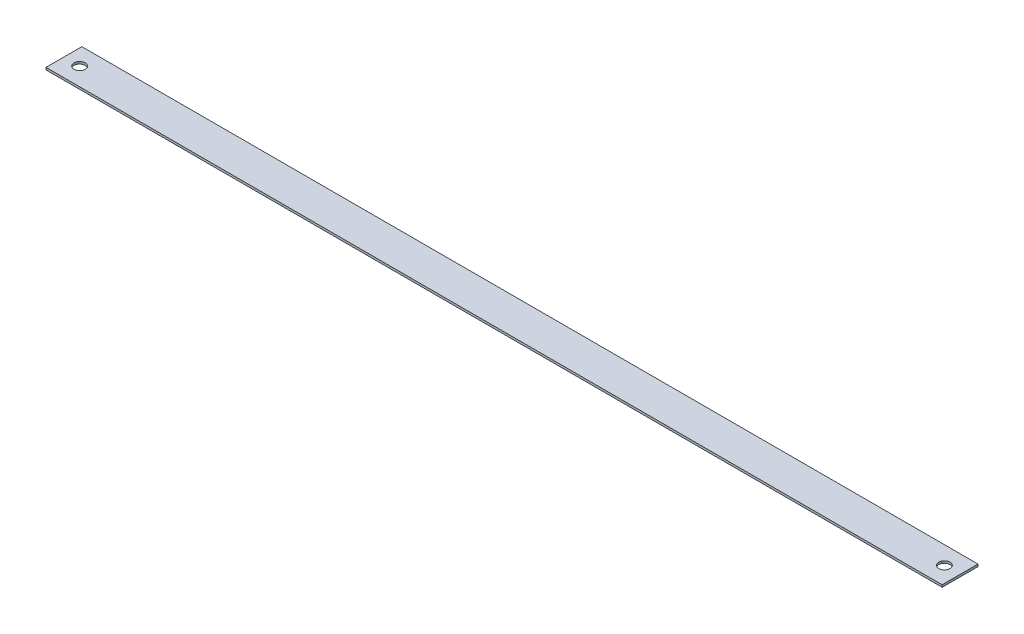
ISO-10303-21;
HEADER;
FILE_DESCRIPTION(('STEP AP214'),'2;1');
FILE_NAME('part.step','',(''),(''),'','','');
FILE_SCHEMA(('AUTOMOTIVE_DESIGN { 1 0 10303 214 1 1 1 1 }'));
ENDSEC;
DATA;
#1=APPLICATION_CONTEXT('core data for automotive mechanical design processes');
#2=APPLICATION_PROTOCOL_DEFINITION('international standard','automotive_design',2000,#1);
#3=PRODUCT_CONTEXT('',#1,'mechanical');
#4=PRODUCT('Part','Part','',(#3));
#5=PRODUCT_RELATED_PRODUCT_CATEGORY('part','',(#4));
#6=PRODUCT_DEFINITION_FORMATION('','',#4);
#7=PRODUCT_DEFINITION_CONTEXT('part definition',#1,'design');
#8=PRODUCT_DEFINITION('design','',#6,#7);
#9=PRODUCT_DEFINITION_SHAPE('','',#8);
#10=(LENGTH_UNIT() NAMED_UNIT(*) SI_UNIT(.MILLI.,.METRE.));
#11=(NAMED_UNIT(*) PLANE_ANGLE_UNIT() SI_UNIT($,.RADIAN.));
#12=(NAMED_UNIT(*) SI_UNIT($,.STERADIAN.) SOLID_ANGLE_UNIT());
#13=UNCERTAINTY_MEASURE_WITH_UNIT(LENGTH_MEASURE(1.E-05),#10,'distance_accuracy_value','');
#14=(GEOMETRIC_REPRESENTATION_CONTEXT(3) GLOBAL_UNCERTAINTY_ASSIGNED_CONTEXT((#13)) GLOBAL_UNIT_ASSIGNED_CONTEXT((#10,
#11,#12)) REPRESENTATION_CONTEXT('',''));
#15=CARTESIAN_POINT('',(0.,0.,0.));
#16=DIRECTION('',(0.,0.,1.));
#17=DIRECTION('',(1.,0.,0.));
#18=AXIS2_PLACEMENT_3D('',#15,#16,#17);
#19=CARTESIAN_POINT('',(0.,1.,0.));
#20=DIRECTION('',(0.,1.,0.));
#21=DIRECTION('',(0.,0.,1.));
#22=AXIS2_PLACEMENT_3D('',#19,#20,#21);
#23=PLANE('',#22);
#24=CARTESIAN_POINT('',(-393.,1.,-7.99999999999999));
#25=DIRECTION('',(0.,1.,0.));
#26=DIRECTION('',(0.,0.,1.));
#27=AXIS2_PLACEMENT_3D('',#24,#25,#26);
#28=CIRCLE('',#27,2.50000000000002);
#29=CARTESIAN_POINT('',(-393.,1.,-5.49999999999997));
#30=VERTEX_POINT('',#29);
#31=EDGE_CURVE('E100',#30,#30,#28,.T.);
#32=ORIENTED_EDGE('',*,*,#31,.F.);
#33=EDGE_LOOP('',(#32));
#34=FACE_BOUND('',#33,.T.);
#35=DIRECTION('',(0.,0.,-1.));
#36=VECTOR('',#35,1.);
#37=CARTESIAN_POINT('',(0.,1.,0.));
#38=LINE('',#37,#36);
#39=CARTESIAN_POINT('',(0.,1.,0.));
#40=VERTEX_POINT('',#39);
#41=CARTESIAN_POINT('',(0.,1.,-16.0000000000001));
#42=VERTEX_POINT('',#41);
#43=EDGE_CURVE('E85',#40,#42,#38,.T.);
#44=ORIENTED_EDGE('',*,*,#43,.T.);
#45=DIRECTION('',(-1.,0.,0.));
#46=VECTOR('',#45,1.);
#47=CARTESIAN_POINT('',(0.,1.,-16.0000000000001));
#48=LINE('',#47,#46);
#49=CARTESIAN_POINT('',(-400.,1.,-16.));
#50=VERTEX_POINT('',#49);
#51=EDGE_CURVE('E80',#42,#50,#48,.T.);
#52=ORIENTED_EDGE('',*,*,#51,.T.);
#53=DIRECTION('',(0.,0.,1.));
#54=VECTOR('',#53,1.);
#55=CARTESIAN_POINT('',(-400.,1.,0.));
#56=LINE('',#55,#54);
#57=CARTESIAN_POINT('',(-400.,1.,0.));
#58=VERTEX_POINT('',#57);
#59=EDGE_CURVE('E83',#50,#58,#56,.T.);
#60=ORIENTED_EDGE('',*,*,#59,.T.);
#61=DIRECTION('',(1.,0.,0.));
#62=VECTOR('',#61,1.);
#63=CARTESIAN_POINT('',(0.,1.,0.));
#64=LINE('',#63,#62);
#65=EDGE_CURVE('E50',#58,#40,#64,.T.);
#66=ORIENTED_EDGE('',*,*,#65,.T.);
#67=EDGE_LOOP('',(#44,#52,#60,#66));
#68=FACE_BOUND('',#67,.T.);
#69=CARTESIAN_POINT('',(-7.00000000000001,1.,-7.99999999999999));
#70=DIRECTION('',(0.,1.,0.));
#71=DIRECTION('',(0.,0.,1.));
#72=AXIS2_PLACEMENT_3D('',#69,#70,#71);
#73=CIRCLE('',#72,2.50000000000002);
#74=CARTESIAN_POINT('',(-7.00000000000001,1.,-5.49999999999997));
#75=VERTEX_POINT('',#74);
#76=EDGE_CURVE('E115',#75,#75,#73,.T.);
#77=ORIENTED_EDGE('',*,*,#76,.F.);
#78=EDGE_LOOP('',(#77));
#79=FACE_BOUND('',#78,.T.);
#80=ADVANCED_FACE('F33',(#34,#68,#79),#23,.T.);
#81=CARTESIAN_POINT('',(0.,0.,0.));
#82=DIRECTION('',(0.,1.,0.));
#83=DIRECTION('',(0.,0.,1.));
#84=AXIS2_PLACEMENT_3D('',#81,#82,#83);
#85=PLANE('',#84);
#86=DIRECTION('',(0.,0.,-1.));
#87=VECTOR('',#86,1.);
#88=CARTESIAN_POINT('',(0.,0.,0.));
#89=LINE('',#88,#87);
#90=CARTESIAN_POINT('',(0.,0.,0.));
#91=VERTEX_POINT('',#90);
#92=CARTESIAN_POINT('',(0.,0.,-16.0000000000001));
#93=VERTEX_POINT('',#92);
#94=EDGE_CURVE('E97',#91,#93,#89,.T.);
#95=ORIENTED_EDGE('',*,*,#94,.F.);
#96=DIRECTION('',(1.,0.,0.));
#97=VECTOR('',#96,1.);
#98=CARTESIAN_POINT('',(0.,0.,0.));
#99=LINE('',#98,#97);
#100=CARTESIAN_POINT('',(-400.,0.,0.));
#101=VERTEX_POINT('',#100);
#102=EDGE_CURVE('E73',#101,#91,#99,.T.);
#103=ORIENTED_EDGE('',*,*,#102,.F.);
#104=DIRECTION('',(0.,0.,1.));
#105=VECTOR('',#104,1.);
#106=CARTESIAN_POINT('',(-400.,0.,0.));
#107=LINE('',#106,#105);
#108=CARTESIAN_POINT('',(-400.,0.,-16.));
#109=VERTEX_POINT('',#108);
#110=EDGE_CURVE('E67',#109,#101,#107,.T.);
#111=ORIENTED_EDGE('',*,*,#110,.F.);
#112=DIRECTION('',(-1.,0.,0.));
#113=VECTOR('',#112,1.);
#114=CARTESIAN_POINT('',(0.,0.,-16.0000000000001));
#115=LINE('',#114,#113);
#116=EDGE_CURVE('E89',#93,#109,#115,.T.);
#117=ORIENTED_EDGE('',*,*,#116,.F.);
#118=EDGE_LOOP('',(#95,#103,#111,#117));
#119=FACE_BOUND('',#118,.T.);
#120=CARTESIAN_POINT('',(-393.,0.,-7.99999999999999));
#121=DIRECTION('',(0.,1.,0.));
#122=DIRECTION('',(0.,0.,1.));
#123=AXIS2_PLACEMENT_3D('',#120,#121,#122);
#124=CIRCLE('',#123,2.50000000000002);
#125=CARTESIAN_POINT('',(-393.,0.,-5.49999999999997));
#126=VERTEX_POINT('',#125);
#127=EDGE_CURVE('E112',#126,#126,#124,.T.);
#128=ORIENTED_EDGE('',*,*,#127,.T.);
#129=EDGE_LOOP('',(#128));
#130=FACE_BOUND('',#129,.T.);
#131=CARTESIAN_POINT('',(-7.00000000000001,0.,-7.99999999999999));
#132=DIRECTION('',(0.,1.,0.));
#133=DIRECTION('',(0.,0.,1.));
#134=AXIS2_PLACEMENT_3D('',#131,#132,#133);
#135=CIRCLE('',#134,2.50000000000002);
#136=CARTESIAN_POINT('',(-7.00000000000001,0.,-5.49999999999997));
#137=VERTEX_POINT('',#136);
#138=EDGE_CURVE('E118',#137,#137,#135,.T.);
#139=ORIENTED_EDGE('',*,*,#138,.T.);
#140=EDGE_LOOP('',(#139));
#141=FACE_BOUND('',#140,.T.);
#142=ADVANCED_FACE('F108',(#119,#130,#141),#85,.F.);
#143=CARTESIAN_POINT('',(0.,1.,0.));
#144=DIRECTION('',(-1.,0.,0.));
#145=DIRECTION('',(0.,0.,1.));
#146=AXIS2_PLACEMENT_3D('',#143,#144,#145);
#147=PLANE('',#146);
#148=ORIENTED_EDGE('',*,*,#94,.T.);
#149=DIRECTION('',(0.,-1.,0.));
#150=VECTOR('',#149,1.);
#151=CARTESIAN_POINT('',(0.,1.,-16.0000000000001));
#152=LINE('',#151,#150);
#153=EDGE_CURVE('E11',#42,#93,#152,.T.);
#154=ORIENTED_EDGE('',*,*,#153,.F.);
#155=ORIENTED_EDGE('',*,*,#43,.F.);
#156=DIRECTION('',(0.,-1.,0.));
#157=VECTOR('',#156,1.);
#158=CARTESIAN_POINT('',(0.,1.,0.));
#159=LINE('',#158,#157);
#160=EDGE_CURVE('E93',#40,#91,#159,.T.);
#161=ORIENTED_EDGE('',*,*,#160,.T.);
#162=EDGE_LOOP('',(#148,#154,#155,#161));
#163=FACE_BOUND('',#162,.T.);
#164=ADVANCED_FACE('F35',(#163),#147,.F.);
#165=CARTESIAN_POINT('',(0.,1.,-16.0000000000001));
#166=DIRECTION('',(0.,0.,1.));
#167=DIRECTION('',(1.,0.,0.));
#168=AXIS2_PLACEMENT_3D('',#165,#166,#167);
#169=PLANE('',#168);
#170=ORIENTED_EDGE('',*,*,#116,.T.);
#171=DIRECTION('',(0.,-1.,0.));
#172=VECTOR('',#171,1.);
#173=CARTESIAN_POINT('',(-400.,1.,-16.));
#174=LINE('',#173,#172);
#175=EDGE_CURVE('E42',#50,#109,#174,.T.);
#176=ORIENTED_EDGE('',*,*,#175,.F.);
#177=ORIENTED_EDGE('',*,*,#51,.F.);
#178=ORIENTED_EDGE('',*,*,#153,.T.);
#179=EDGE_LOOP('',(#170,#176,#177,#178));
#180=FACE_BOUND('',#179,.T.);
#181=ADVANCED_FACE('F88',(#180),#169,.F.);
#182=CARTESIAN_POINT('',(-400.,1.,0.));
#183=DIRECTION('',(1.,0.,0.));
#184=DIRECTION('',(0.,0.,-1.));
#185=AXIS2_PLACEMENT_3D('',#182,#183,#184);
#186=PLANE('',#185);
#187=ORIENTED_EDGE('',*,*,#110,.T.);
#188=DIRECTION('',(0.,-1.,0.));
#189=VECTOR('',#188,1.);
#190=CARTESIAN_POINT('',(-400.,1.,0.));
#191=LINE('',#190,#189);
#192=EDGE_CURVE('E90',#58,#101,#191,.T.);
#193=ORIENTED_EDGE('',*,*,#192,.F.);
#194=ORIENTED_EDGE('',*,*,#59,.F.);
#195=ORIENTED_EDGE('',*,*,#175,.T.);
#196=EDGE_LOOP('',(#187,#193,#194,#195));
#197=FACE_BOUND('',#196,.T.);
#198=ADVANCED_FACE('F91',(#197),#186,.F.);
#199=CARTESIAN_POINT('',(0.,1.,0.));
#200=DIRECTION('',(0.,0.,-1.));
#201=DIRECTION('',(-1.,0.,0.));
#202=AXIS2_PLACEMENT_3D('',#199,#200,#201);
#203=PLANE('',#202);
#204=ORIENTED_EDGE('',*,*,#102,.T.);
#205=ORIENTED_EDGE('',*,*,#160,.F.);
#206=ORIENTED_EDGE('',*,*,#65,.F.);
#207=ORIENTED_EDGE('',*,*,#192,.T.);
#208=EDGE_LOOP('',(#204,#205,#206,#207));
#209=FACE_BOUND('',#208,.T.);
#210=ADVANCED_FACE('F105',(#209),#203,.F.);
#211=CARTESIAN_POINT('',(-393.,1.,-7.99999999999999));
#212=DIRECTION('',(0.,-1.,0.));
#213=DIRECTION('',(0.,0.,-1.));
#214=AXIS2_PLACEMENT_3D('',#211,#212,#213);
#215=CYLINDRICAL_SURFACE('',#214,2.50000000000002);
#216=ORIENTED_EDGE('',*,*,#31,.T.);
#217=EDGE_LOOP('',(#216));
#218=FACE_BOUND('',#217,.T.);
#219=ORIENTED_EDGE('',*,*,#127,.F.);
#220=EDGE_LOOP('',(#219));
#221=FACE_BOUND('',#220,.T.);
#222=ADVANCED_FACE('F135',(#218,#221),#215,.F.);
#223=CARTESIAN_POINT('',(-7.00000000000001,1.,-7.99999999999999));
#224=DIRECTION('',(0.,-1.,0.));
#225=DIRECTION('',(0.,0.,-1.));
#226=AXIS2_PLACEMENT_3D('',#223,#224,#225);
#227=CYLINDRICAL_SURFACE('',#226,2.50000000000002);
#228=ORIENTED_EDGE('',*,*,#76,.T.);
#229=EDGE_LOOP('',(#228));
#230=FACE_BOUND('',#229,.T.);
#231=ORIENTED_EDGE('',*,*,#138,.F.);
#232=EDGE_LOOP('',(#231));
#233=FACE_BOUND('',#232,.T.);
#234=ADVANCED_FACE('F124',(#230,#233),#227,.F.);
#235=CLOSED_SHELL('',(#80,#142,#164,#181,#198,#210,#222,#234));
#236=MANIFOLD_SOLID_BREP('B2',#235);
#237=ADVANCED_BREP_SHAPE_REPRESENTATION('',(#18,#236),#14);
#238=SHAPE_DEFINITION_REPRESENTATION(#9,#237);
ENDSEC;
END-ISO-10303-21;
